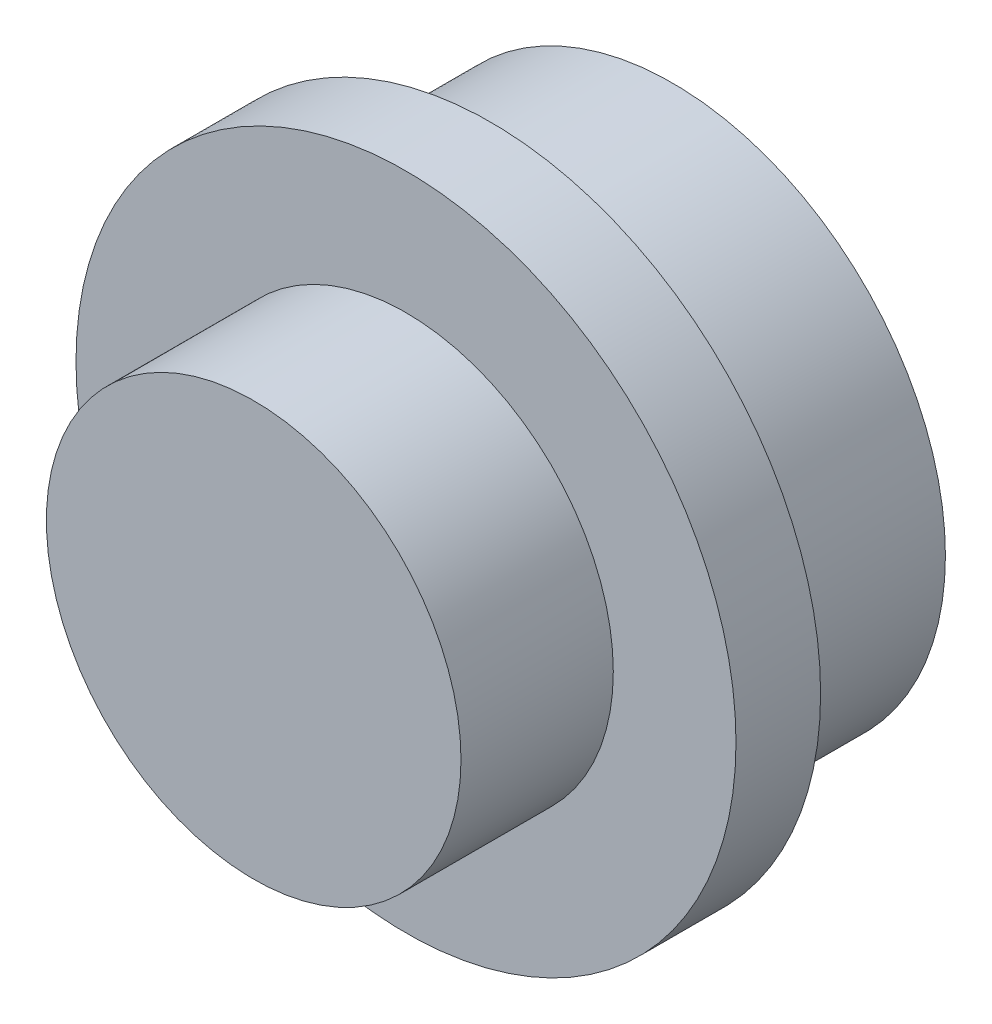
ISO-10303-21;
HEADER;
FILE_DESCRIPTION(('STEP AP214'),'2;1');
FILE_NAME('part.step','',(''),(''),'','','');
FILE_SCHEMA(('AUTOMOTIVE_DESIGN { 1 0 10303 214 1 1 1 1 }'));
ENDSEC;
DATA;
#1=APPLICATION_CONTEXT('core data for automotive mechanical design processes');
#2=APPLICATION_PROTOCOL_DEFINITION('international standard','automotive_design',2000,#1);
#3=PRODUCT_CONTEXT('',#1,'mechanical');
#4=PRODUCT('Part','Part','',(#3));
#5=PRODUCT_RELATED_PRODUCT_CATEGORY('part','',(#4));
#6=PRODUCT_DEFINITION_FORMATION('','',#4);
#7=PRODUCT_DEFINITION_CONTEXT('part definition',#1,'design');
#8=PRODUCT_DEFINITION('design','',#6,#7);
#9=PRODUCT_DEFINITION_SHAPE('','',#8);
#10=(LENGTH_UNIT() NAMED_UNIT(*) SI_UNIT(.MILLI.,.METRE.));
#11=(NAMED_UNIT(*) PLANE_ANGLE_UNIT() SI_UNIT($,.RADIAN.));
#12=(NAMED_UNIT(*) SI_UNIT($,.STERADIAN.) SOLID_ANGLE_UNIT());
#13=UNCERTAINTY_MEASURE_WITH_UNIT(LENGTH_MEASURE(1.E-05),#10,'distance_accuracy_value','');
#14=(GEOMETRIC_REPRESENTATION_CONTEXT(3) GLOBAL_UNCERTAINTY_ASSIGNED_CONTEXT((#13)) GLOBAL_UNIT_ASSIGNED_CONTEXT((#10,
#11,#12)) REPRESENTATION_CONTEXT('',''));
#15=CARTESIAN_POINT('',(0.,0.,0.));
#16=DIRECTION('',(0.,0.,1.));
#17=DIRECTION('',(1.,0.,0.));
#18=AXIS2_PLACEMENT_3D('',#15,#16,#17);
#19=CARTESIAN_POINT('',(0.,0.,-1.));
#20=DIRECTION('',(0.,0.,1.));
#21=DIRECTION('',(1.,0.,0.));
#22=AXIS2_PLACEMENT_3D('',#19,#20,#21);
#23=CYLINDRICAL_SURFACE('',#22,3.9);
#24=CARTESIAN_POINT('',(0.,0.,-1.));
#25=DIRECTION('',(0.,0.,1.));
#26=DIRECTION('',(1.,0.,0.));
#27=AXIS2_PLACEMENT_3D('',#24,#25,#26);
#28=CIRCLE('',#27,3.9);
#29=CARTESIAN_POINT('',(3.9,0.,-1.));
#30=VERTEX_POINT('',#29);
#31=EDGE_CURVE('E41',#30,#30,#28,.T.);
#32=ORIENTED_EDGE('',*,*,#31,.T.);
#33=EDGE_LOOP('',(#32));
#34=FACE_BOUND('',#33,.T.);
#35=CARTESIAN_POINT('',(0.,0.,0.));
#36=DIRECTION('',(0.,0.,1.));
#37=DIRECTION('',(1.,0.,0.));
#38=AXIS2_PLACEMENT_3D('',#35,#36,#37);
#39=CIRCLE('',#38,3.9);
#40=CARTESIAN_POINT('',(3.9,0.,0.));
#41=VERTEX_POINT('',#40);
#42=EDGE_CURVE('E46',#41,#41,#39,.T.);
#43=ORIENTED_EDGE('',*,*,#42,.F.);
#44=EDGE_LOOP('',(#43));
#45=FACE_BOUND('',#44,.T.);
#46=ADVANCED_FACE('F31',(#34,#45),#23,.T.);
#47=CARTESIAN_POINT('',(0.,0.,-1.));
#48=DIRECTION('',(0.,0.,1.));
#49=DIRECTION('',(1.,0.,0.));
#50=AXIS2_PLACEMENT_3D('',#47,#48,#49);
#51=PLANE('',#50);
#52=CARTESIAN_POINT('',(0.,0.,-1.));
#53=DIRECTION('',(0.,0.,1.));
#54=DIRECTION('',(1.,0.,0.));
#55=AXIS2_PLACEMENT_3D('',#52,#53,#54);
#56=CIRCLE('',#55,3.225);
#57=CARTESIAN_POINT('',(3.225,0.,-1.));
#58=VERTEX_POINT('',#57);
#59=EDGE_CURVE('E10',#58,#58,#56,.F.);
#60=ORIENTED_EDGE('',*,*,#59,.F.);
#61=EDGE_LOOP('',(#60));
#62=FACE_BOUND('',#61,.T.);
#63=ORIENTED_EDGE('',*,*,#31,.F.);
#64=EDGE_LOOP('',(#63));
#65=FACE_BOUND('',#64,.T.);
#66=ADVANCED_FACE('F94',(#62,#65),#51,.F.);
#67=CARTESIAN_POINT('',(0.,0.,0.));
#68=DIRECTION('',(0.,0.,1.));
#69=DIRECTION('',(1.,0.,0.));
#70=AXIS2_PLACEMENT_3D('',#67,#68,#69);
#71=PLANE('',#70);
#72=CARTESIAN_POINT('',(0.,0.,0.));
#73=DIRECTION('',(0.,0.,1.));
#74=DIRECTION('',(1.,0.,0.));
#75=AXIS2_PLACEMENT_3D('',#72,#73,#74);
#76=CIRCLE('',#75,2.45);
#77=CARTESIAN_POINT('',(2.45,0.,0.));
#78=VERTEX_POINT('',#77);
#79=EDGE_CURVE('E37',#78,#78,#76,.T.);
#80=ORIENTED_EDGE('',*,*,#79,.F.);
#81=EDGE_LOOP('',(#80));
#82=FACE_BOUND('',#81,.T.);
#83=ORIENTED_EDGE('',*,*,#42,.T.);
#84=EDGE_LOOP('',(#83));
#85=FACE_BOUND('',#84,.T.);
#86=ADVANCED_FACE('F99',(#82,#85),#71,.T.);
#87=CARTESIAN_POINT('',(0.,0.,1.8));
#88=DIRECTION('',(0.,0.,-1.));
#89=DIRECTION('',(-1.,0.,0.));
#90=AXIS2_PLACEMENT_3D('',#87,#88,#89);
#91=CYLINDRICAL_SURFACE('',#90,2.45);
#92=CARTESIAN_POINT('',(0.,0.,1.8));
#93=DIRECTION('',(0.,0.,1.));
#94=DIRECTION('',(1.,0.,0.));
#95=AXIS2_PLACEMENT_3D('',#92,#93,#94);
#96=CIRCLE('',#95,2.45);
#97=CARTESIAN_POINT('',(2.45,0.,1.8));
#98=VERTEX_POINT('',#97);
#99=EDGE_CURVE('E49',#98,#98,#96,.T.);
#100=ORIENTED_EDGE('',*,*,#99,.F.);
#101=EDGE_LOOP('',(#100));
#102=FACE_BOUND('',#101,.T.);
#103=ORIENTED_EDGE('',*,*,#79,.T.);
#104=EDGE_LOOP('',(#103));
#105=FACE_BOUND('',#104,.T.);
#106=ADVANCED_FACE('F90',(#102,#105),#91,.T.);
#107=CARTESIAN_POINT('',(0.,0.,1.8));
#108=DIRECTION('',(0.,0.,1.));
#109=DIRECTION('',(1.,0.,0.));
#110=AXIS2_PLACEMENT_3D('',#107,#108,#109);
#111=PLANE('',#110);
#112=ORIENTED_EDGE('',*,*,#99,.T.);
#113=EDGE_LOOP('',(#112));
#114=FACE_BOUND('',#113,.T.);
#115=ADVANCED_FACE('F81',(#114),#111,.T.);
#116=CARTESIAN_POINT('',(0.,0.,-3.15));
#117=DIRECTION('',(0.,0.,-1.));
#118=DIRECTION('',(-1.,0.,0.));
#119=AXIS2_PLACEMENT_3D('',#116,#117,#118);
#120=PLANE('',#119);
#121=CARTESIAN_POINT('',(0.,0.,-3.15));
#122=DIRECTION('',(0.,0.,-1.));
#123=DIRECTION('',(-1.,0.,0.));
#124=AXIS2_PLACEMENT_3D('',#121,#122,#123);
#125=CIRCLE('',#124,3.225);
#126=CARTESIAN_POINT('',(3.225,0.,-3.15));
#127=VERTEX_POINT('',#126);
#128=EDGE_CURVE('E63',#127,#127,#125,.T.);
#129=ORIENTED_EDGE('',*,*,#128,.T.);
#130=EDGE_LOOP('',(#129));
#131=FACE_BOUND('',#130,.T.);
#132=CARTESIAN_POINT('',(0.,0.,-3.15));
#133=DIRECTION('',(0.,0.,-1.));
#134=DIRECTION('',(-1.,0.,0.));
#135=AXIS2_PLACEMENT_3D('',#132,#133,#134);
#136=CIRCLE('',#135,2.345);
#137=CARTESIAN_POINT('',(2.345,0.,-3.15));
#138=VERTEX_POINT('',#137);
#139=EDGE_CURVE('E68',#138,#138,#136,.T.);
#140=ORIENTED_EDGE('',*,*,#139,.F.);
#141=EDGE_LOOP('',(#140));
#142=FACE_BOUND('',#141,.T.);
#143=ADVANCED_FACE('F78',(#131,#142),#120,.T.);
#144=CARTESIAN_POINT('',(0.,0.,-3.15));
#145=DIRECTION('',(0.,0.,1.));
#146=DIRECTION('',(1.,0.,0.));
#147=AXIS2_PLACEMENT_3D('',#144,#145,#146);
#148=CYLINDRICAL_SURFACE('',#147,3.225);
#149=CARTESIAN_POINT('',(3.225,0.,-3.15));
#150=CARTESIAN_POINT('',(3.225,0.,-3.12760416666667));
#151=CARTESIAN_POINT('',(3.225,0.,-3.10520833333333));
#152=CARTESIAN_POINT('',(3.225,0.,-3.06041666666667));
#153=CARTESIAN_POINT('',(3.225,0.,-3.03802083333333));
#154=CARTESIAN_POINT('',(3.225,0.,-2.99322916666667));
#155=CARTESIAN_POINT('',(3.225,0.,-2.97083333333333));
#156=CARTESIAN_POINT('',(3.225,0.,-2.92604166666667));
#157=CARTESIAN_POINT('',(3.225,0.,-2.90364583333333));
#158=CARTESIAN_POINT('',(3.225,0.,-2.85885416666667));
#159=CARTESIAN_POINT('',(3.225,0.,-2.83645833333333));
#160=CARTESIAN_POINT('',(3.225,0.,-2.79166666666667));
#161=CARTESIAN_POINT('',(3.225,0.,-2.76927083333333));
#162=CARTESIAN_POINT('',(3.225,0.,-2.72447916666667));
#163=CARTESIAN_POINT('',(3.225,0.,-2.70208333333333));
#164=CARTESIAN_POINT('',(3.225,0.,-2.65729166666667));
#165=CARTESIAN_POINT('',(3.225,0.,-2.63489583333333));
#166=CARTESIAN_POINT('',(3.225,0.,-2.59010416666667));
#167=CARTESIAN_POINT('',(3.225,0.,-2.56770833333333));
#168=CARTESIAN_POINT('',(3.225,0.,-2.52291666666667));
#169=CARTESIAN_POINT('',(3.225,0.,-2.50052083333333));
#170=CARTESIAN_POINT('',(3.225,0.,-2.45572916666667));
#171=CARTESIAN_POINT('',(3.225,0.,-2.43333333333333));
#172=CARTESIAN_POINT('',(3.225,0.,-2.38854166666667));
#173=CARTESIAN_POINT('',(3.225,0.,-2.36614583333333));
#174=CARTESIAN_POINT('',(3.225,0.,-2.32135416666667));
#175=CARTESIAN_POINT('',(3.225,0.,-2.29895833333333));
#176=CARTESIAN_POINT('',(3.225,0.,-2.25416666666667));
#177=CARTESIAN_POINT('',(3.225,0.,-2.23177083333333));
#178=CARTESIAN_POINT('',(3.225,0.,-2.18697916666667));
#179=CARTESIAN_POINT('',(3.225,0.,-2.16458333333333));
#180=CARTESIAN_POINT('',(3.225,0.,-2.11979166666667));
#181=CARTESIAN_POINT('',(3.225,0.,-2.09739583333333));
#182=CARTESIAN_POINT('',(3.225,0.,-2.05260416666667));
#183=CARTESIAN_POINT('',(3.225,0.,-2.03020833333333));
#184=CARTESIAN_POINT('',(3.225,0.,-1.98541666666667));
#185=CARTESIAN_POINT('',(3.225,0.,-1.96302083333333));
#186=CARTESIAN_POINT('',(3.225,0.,-1.91822916666667));
#187=CARTESIAN_POINT('',(3.225,0.,-1.89583333333333));
#188=CARTESIAN_POINT('',(3.225,0.,-1.85104166666667));
#189=CARTESIAN_POINT('',(3.225,0.,-1.82864583333333));
#190=CARTESIAN_POINT('',(3.225,0.,-1.78385416666667));
#191=CARTESIAN_POINT('',(3.225,0.,-1.76145833333333));
#192=CARTESIAN_POINT('',(3.225,0.,-1.71666666666667));
#193=CARTESIAN_POINT('',(3.225,0.,-1.69427083333333));
#194=CARTESIAN_POINT('',(3.225,0.,-1.64947916666667));
#195=CARTESIAN_POINT('',(3.225,0.,-1.62708333333333));
#196=CARTESIAN_POINT('',(3.225,0.,-1.58229166666667));
#197=CARTESIAN_POINT('',(3.225,0.,-1.55989583333333));
#198=CARTESIAN_POINT('',(3.225,0.,-1.51510416666667));
#199=CARTESIAN_POINT('',(3.225,0.,-1.49270833333333));
#200=CARTESIAN_POINT('',(3.225,0.,-1.44791666666667));
#201=CARTESIAN_POINT('',(3.225,0.,-1.42552083333333));
#202=CARTESIAN_POINT('',(3.225,0.,-1.38072916666667));
#203=CARTESIAN_POINT('',(3.225,0.,-1.35833333333333));
#204=CARTESIAN_POINT('',(3.225,0.,-1.31354166666667));
#205=CARTESIAN_POINT('',(3.225,0.,-1.29114583333333));
#206=CARTESIAN_POINT('',(3.225,0.,-1.24635416666667));
#207=CARTESIAN_POINT('',(3.225,0.,-1.22395833333333));
#208=CARTESIAN_POINT('',(3.225,0.,-1.17916666666667));
#209=CARTESIAN_POINT('',(3.225,0.,-1.15677083333333));
#210=CARTESIAN_POINT('',(3.225,0.,-1.11197916666667));
#211=CARTESIAN_POINT('',(3.225,0.,-1.08958333333333));
#212=CARTESIAN_POINT('',(3.225,0.,-1.04479166666667));
#213=CARTESIAN_POINT('',(3.225,0.,-1.02239583333333));
#214=CARTESIAN_POINT('',(3.225,0.,-1.));
#215=B_SPLINE_CURVE_WITH_KNOTS('',3,(#149,#150,#151,#152,#153,#154,#155,#156,#157,#158,#159,
#160,#161,#162,#163,#164,#165,#166,#167,#168,#169,#170,#171,#172,#173,#174,#175,#176,#177,#178,
#179,#180,#181,#182,#183,#184,#185,#186,#187,#188,#189,#190,#191,#192,#193,#194,#195,#196,#197,
#198,#199,#200,#201,#202,#203,#204,#205,#206,#207,#208,#209,#210,#211,#212,#213,#214),
.UNSPECIFIED.,.F.,.F.,(4,2,2,2,2,2,2,2,2,2,2,2,2,2,2,2,2,2,2,2,2,2,2,2,2,2,2,2,2,2,2,2,4),(0.,
0.0671875,0.134375,0.2015625,0.268749999999999,0.3359375,0.403125,0.4703125,0.537499999999999,
0.6046875,0.671874999999999,0.7390625,0.80625,0.8734375,0.940625,1.0078125,1.075,1.1421875,
1.209375,1.2765625,1.34375,1.4109375,1.478125,1.5453125,1.6125,1.6796875,1.746875,1.8140625,
1.88125,1.9484375,2.015625,2.0828125,2.15),.UNSPECIFIED.);
#216=EDGE_CURVE('BSEAM80',#127,#58,#215,.T.);
#217=ORIENTED_EDGE('',*,*,#128,.F.);
#218=ORIENTED_EDGE('',*,*,#59,.T.);
#219=ORIENTED_EDGE('',*,*,#216,.T.);
#220=ORIENTED_EDGE('',*,*,#216,.F.);
#221=EDGE_LOOP('',(#217,#219,#218,#220));
#222=FACE_BOUND('',#221,.T.);
#223=ADVANCED_FACE('F80',(#222),#148,.T.);
#224=CARTESIAN_POINT('',(0.,0.,-3.15));
#225=DIRECTION('',(0.,0.,1.));
#226=DIRECTION('',(1.,0.,0.));
#227=AXIS2_PLACEMENT_3D('',#224,#225,#226);
#228=CYLINDRICAL_SURFACE('',#227,2.345);
#229=CARTESIAN_POINT('',(0.,0.,-1.));
#230=DIRECTION('',(0.,0.,-1.));
#231=DIRECTION('',(-1.,0.,0.));
#232=AXIS2_PLACEMENT_3D('',#229,#230,#231);
#233=CIRCLE('',#232,2.345);
#234=CARTESIAN_POINT('',(2.345,0.,-1.));
#235=VERTEX_POINT('',#234);
#236=EDGE_CURVE('E69',#235,#235,#233,.T.);
#237=CARTESIAN_POINT('',(2.345,0.,-3.15));
#238=CARTESIAN_POINT('',(2.345,0.,-3.12760416666667));
#239=CARTESIAN_POINT('',(2.345,0.,-3.10520833333333));
#240=CARTESIAN_POINT('',(2.345,0.,-3.06041666666667));
#241=CARTESIAN_POINT('',(2.345,0.,-3.03802083333333));
#242=CARTESIAN_POINT('',(2.345,0.,-2.99322916666667));
#243=CARTESIAN_POINT('',(2.345,0.,-2.97083333333333));
#244=CARTESIAN_POINT('',(2.345,0.,-2.92604166666667));
#245=CARTESIAN_POINT('',(2.345,0.,-2.90364583333333));
#246=CARTESIAN_POINT('',(2.345,0.,-2.85885416666667));
#247=CARTESIAN_POINT('',(2.345,0.,-2.83645833333333));
#248=CARTESIAN_POINT('',(2.345,0.,-2.79166666666667));
#249=CARTESIAN_POINT('',(2.345,0.,-2.76927083333333));
#250=CARTESIAN_POINT('',(2.345,0.,-2.72447916666667));
#251=CARTESIAN_POINT('',(2.345,0.,-2.70208333333333));
#252=CARTESIAN_POINT('',(2.345,0.,-2.65729166666667));
#253=CARTESIAN_POINT('',(2.345,0.,-2.63489583333333));
#254=CARTESIAN_POINT('',(2.345,0.,-2.59010416666667));
#255=CARTESIAN_POINT('',(2.345,0.,-2.56770833333333));
#256=CARTESIAN_POINT('',(2.345,0.,-2.52291666666667));
#257=CARTESIAN_POINT('',(2.345,0.,-2.50052083333333));
#258=CARTESIAN_POINT('',(2.345,0.,-2.45572916666667));
#259=CARTESIAN_POINT('',(2.345,0.,-2.43333333333333));
#260=CARTESIAN_POINT('',(2.345,0.,-2.38854166666667));
#261=CARTESIAN_POINT('',(2.345,0.,-2.36614583333333));
#262=CARTESIAN_POINT('',(2.345,0.,-2.32135416666667));
#263=CARTESIAN_POINT('',(2.345,0.,-2.29895833333333));
#264=CARTESIAN_POINT('',(2.345,0.,-2.25416666666667));
#265=CARTESIAN_POINT('',(2.345,0.,-2.23177083333333));
#266=CARTESIAN_POINT('',(2.345,0.,-2.18697916666667));
#267=CARTESIAN_POINT('',(2.345,0.,-2.16458333333333));
#268=CARTESIAN_POINT('',(2.345,0.,-2.11979166666667));
#269=CARTESIAN_POINT('',(2.345,0.,-2.09739583333333));
#270=CARTESIAN_POINT('',(2.345,0.,-2.05260416666667));
#271=CARTESIAN_POINT('',(2.345,0.,-2.03020833333333));
#272=CARTESIAN_POINT('',(2.345,0.,-1.98541666666667));
#273=CARTESIAN_POINT('',(2.345,0.,-1.96302083333333));
#274=CARTESIAN_POINT('',(2.345,0.,-1.91822916666667));
#275=CARTESIAN_POINT('',(2.345,0.,-1.89583333333333));
#276=CARTESIAN_POINT('',(2.345,0.,-1.85104166666667));
#277=CARTESIAN_POINT('',(2.345,0.,-1.82864583333333));
#278=CARTESIAN_POINT('',(2.345,0.,-1.78385416666667));
#279=CARTESIAN_POINT('',(2.345,0.,-1.76145833333333));
#280=CARTESIAN_POINT('',(2.345,0.,-1.71666666666667));
#281=CARTESIAN_POINT('',(2.345,0.,-1.69427083333333));
#282=CARTESIAN_POINT('',(2.345,0.,-1.64947916666667));
#283=CARTESIAN_POINT('',(2.345,0.,-1.62708333333333));
#284=CARTESIAN_POINT('',(2.345,0.,-1.58229166666667));
#285=CARTESIAN_POINT('',(2.345,0.,-1.55989583333333));
#286=CARTESIAN_POINT('',(2.345,0.,-1.51510416666667));
#287=CARTESIAN_POINT('',(2.345,0.,-1.49270833333333));
#288=CARTESIAN_POINT('',(2.345,0.,-1.44791666666667));
#289=CARTESIAN_POINT('',(2.345,0.,-1.42552083333333));
#290=CARTESIAN_POINT('',(2.345,0.,-1.38072916666667));
#291=CARTESIAN_POINT('',(2.345,0.,-1.35833333333333));
#292=CARTESIAN_POINT('',(2.345,0.,-1.31354166666667));
#293=CARTESIAN_POINT('',(2.345,0.,-1.29114583333333));
#294=CARTESIAN_POINT('',(2.345,0.,-1.24635416666667));
#295=CARTESIAN_POINT('',(2.345,0.,-1.22395833333333));
#296=CARTESIAN_POINT('',(2.345,0.,-1.17916666666667));
#297=CARTESIAN_POINT('',(2.345,0.,-1.15677083333333));
#298=CARTESIAN_POINT('',(2.345,0.,-1.11197916666667));
#299=CARTESIAN_POINT('',(2.345,0.,-1.08958333333333));
#300=CARTESIAN_POINT('',(2.345,0.,-1.04479166666667));
#301=CARTESIAN_POINT('',(2.345,0.,-1.02239583333333));
#302=CARTESIAN_POINT('',(2.345,0.,-1.));
#303=B_SPLINE_CURVE_WITH_KNOTS('',3,(#237,#238,#239,#240,#241,#242,#243,#244,#245,#246,#247,
#248,#249,#250,#251,#252,#253,#254,#255,#256,#257,#258,#259,#260,#261,#262,#263,#264,#265,#266,
#267,#268,#269,#270,#271,#272,#273,#274,#275,#276,#277,#278,#279,#280,#281,#282,#283,#284,#285,
#286,#287,#288,#289,#290,#291,#292,#293,#294,#295,#296,#297,#298,#299,#300,#301,#302),
.UNSPECIFIED.,.F.,.F.,(4,2,2,2,2,2,2,2,2,2,2,2,2,2,2,2,2,2,2,2,2,2,2,2,2,2,2,2,2,2,2,2,4),(0.,
0.0671875000000004,0.134375,0.2015625,0.26875,0.3359375,0.403125,0.4703125,0.5375,0.6046875,
0.671875000000001,0.739062500000001,0.806250000000001,0.873437500000001,0.940625,1.0078125,
1.075,1.1421875,1.209375,1.2765625,1.34375,1.4109375,1.478125,1.5453125,1.6125,1.6796875,
1.746875,1.8140625,1.88125,1.9484375,2.015625,2.0828125,2.15),.UNSPECIFIED.);
#304=EDGE_CURVE('BSEAM75',#138,#235,#303,.T.);
#305=ORIENTED_EDGE('',*,*,#139,.T.);
#306=ORIENTED_EDGE('',*,*,#236,.F.);
#307=ORIENTED_EDGE('',*,*,#304,.T.);
#308=ORIENTED_EDGE('',*,*,#304,.F.);
#309=EDGE_LOOP('',(#305,#307,#306,#308));
#310=FACE_BOUND('',#309,.T.);
#311=ADVANCED_FACE('F75',(#310),#228,.F.);
#312=CARTESIAN_POINT('',(0.,0.,0.3));
#313=DIRECTION('',(0.,0.,1.));
#314=DIRECTION('',(1.,0.,0.));
#315=AXIS2_PLACEMENT_3D('',#312,#313,#314);
#316=PLANE('',#315);
#317=CARTESIAN_POINT('',(0.,0.,0.3));
#318=DIRECTION('',(0.,0.,1.));
#319=DIRECTION('',(1.,0.,0.));
#320=AXIS2_PLACEMENT_3D('',#317,#318,#319);
#321=CIRCLE('',#320,0.950000000000001);
#322=CARTESIAN_POINT('',(0.950000000000001,0.,0.3));
#323=VERTEX_POINT('',#322);
#324=EDGE_CURVE('E59',#323,#323,#321,.T.);
#325=ORIENTED_EDGE('',*,*,#324,.F.);
#326=EDGE_LOOP('',(#325));
#327=FACE_BOUND('',#326,.T.);
#328=ADVANCED_FACE('F117',(#327),#316,.F.);
#329=CARTESIAN_POINT('',(0.,0.,1.8));
#330=DIRECTION('',(0.,0.,-1.));
#331=DIRECTION('',(-1.,0.,0.));
#332=AXIS2_PLACEMENT_3D('',#329,#330,#331);
#333=CYLINDRICAL_SURFACE('',#332,0.950000000000001);
#334=CARTESIAN_POINT('',(0.,0.,-1.));
#335=DIRECTION('',(0.,0.,1.));
#336=DIRECTION('',(1.,0.,0.));
#337=AXIS2_PLACEMENT_3D('',#334,#335,#336);
#338=CIRCLE('',#337,0.950000000000001);
#339=CARTESIAN_POINT('',(0.950000000000001,0.,-1.));
#340=VERTEX_POINT('',#339);
#341=EDGE_CURVE('E55',#340,#340,#338,.F.);
#342=ORIENTED_EDGE('',*,*,#341,.T.);
#343=EDGE_LOOP('',(#342));
#344=FACE_BOUND('',#343,.T.);
#345=ORIENTED_EDGE('',*,*,#324,.T.);
#346=EDGE_LOOP('',(#345));
#347=FACE_BOUND('',#346,.T.);
#348=ADVANCED_FACE('F112',(#344,#347),#333,.F.);
#349=ORIENTED_EDGE('',*,*,#341,.F.);
#350=EDGE_LOOP('',(#349));
#351=FACE_BOUND('',#350,.T.);
#352=ORIENTED_EDGE('',*,*,#236,.T.);
#353=EDGE_LOOP('',(#352));
#354=FACE_BOUND('',#353,.T.);
#355=ADVANCED_FACE('F102',(#351,#354),#51,.F.);
#356=CLOSED_SHELL('',(#46,#66,#86,#106,#115,#143,#223,#311,#328,#348,#355));
#357=MANIFOLD_SOLID_BREP('B2',#356);
#358=ADVANCED_BREP_SHAPE_REPRESENTATION('',(#18,#357),#14);
#359=SHAPE_DEFINITION_REPRESENTATION(#9,#358);
ENDSEC;
END-ISO-10303-21;
